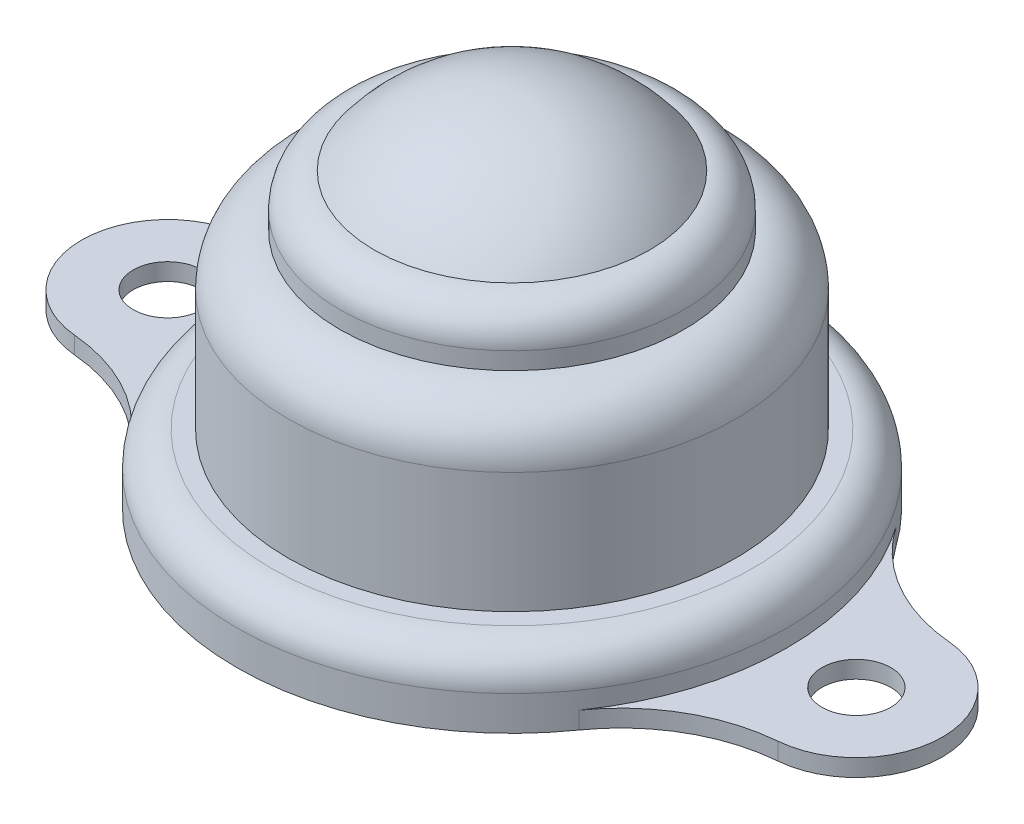
ISO-10303-21;
HEADER;
FILE_DESCRIPTION(('STEP AP214'),'2;1');
FILE_NAME('part.step','',(''),(''),'','','');
FILE_SCHEMA(('AUTOMOTIVE_DESIGN { 1 0 10303 214 1 1 1 1 }'));
ENDSEC;
DATA;
#1=APPLICATION_CONTEXT('core data for automotive mechanical design processes');
#2=APPLICATION_PROTOCOL_DEFINITION('international standard','automotive_design',2000,#1);
#3=PRODUCT_CONTEXT('',#1,'mechanical');
#4=PRODUCT('Part','Part','',(#3));
#5=PRODUCT_RELATED_PRODUCT_CATEGORY('part','',(#4));
#6=PRODUCT_DEFINITION_FORMATION('','',#4);
#7=PRODUCT_DEFINITION_CONTEXT('part definition',#1,'design');
#8=PRODUCT_DEFINITION('design','',#6,#7);
#9=PRODUCT_DEFINITION_SHAPE('','',#8);
#10=(LENGTH_UNIT() NAMED_UNIT(*) SI_UNIT(.MILLI.,.METRE.));
#11=(NAMED_UNIT(*) PLANE_ANGLE_UNIT() SI_UNIT($,.RADIAN.));
#12=(NAMED_UNIT(*) SI_UNIT($,.STERADIAN.) SOLID_ANGLE_UNIT());
#13=UNCERTAINTY_MEASURE_WITH_UNIT(LENGTH_MEASURE(1.E-05),#10,'distance_accuracy_value','');
#14=(GEOMETRIC_REPRESENTATION_CONTEXT(3) GLOBAL_UNCERTAINTY_ASSIGNED_CONTEXT((#13)) GLOBAL_UNIT_ASSIGNED_CONTEXT((#10,
#11,#12)) REPRESENTATION_CONTEXT('',''));
#15=CARTESIAN_POINT('',(0.,0.,0.));
#16=DIRECTION('',(0.,0.,1.));
#17=DIRECTION('',(1.,0.,0.));
#18=AXIS2_PLACEMENT_3D('',#15,#16,#17);
#19=CARTESIAN_POINT('',(0.,14.,0.));
#20=DIRECTION('',(0.,1.,0.));
#21=DIRECTION('',(0.,0.,1.));
#22=AXIS2_PLACEMENT_3D('',#19,#20,#21);
#23=PLANE('',#22);
#24=CARTESIAN_POINT('',(0.,14.,0.));
#25=DIRECTION('',(0.,1.,0.));
#26=DIRECTION('',(0.,0.,1.));
#27=AXIS2_PLACEMENT_3D('',#24,#25,#26);
#28=CIRCLE('',#27,9.53939201416945);
#29=CARTESIAN_POINT('',(0.,14.,9.53939201416945));
#30=VERTEX_POINT('',#29);
#31=EDGE_CURVE('E12',#30,#30,#28,.F.);
#32=ORIENTED_EDGE('',*,*,#31,.F.);
#33=EDGE_LOOP('',(#32));
#34=FACE_BOUND('',#33,.T.);
#35=CARTESIAN_POINT('',(0.,14.,0.));
#36=DIRECTION('',(0.,1.,0.));
#37=DIRECTION('',(0.,0.,1.));
#38=AXIS2_PLACEMENT_3D('',#35,#36,#37);
#39=CIRCLE('',#38,10.);
#40=CARTESIAN_POINT('',(0.,14.,10.));
#41=VERTEX_POINT('',#40);
#42=EDGE_CURVE('E63',#41,#41,#39,.T.);
#43=ORIENTED_EDGE('',*,*,#42,.F.);
#44=EDGE_LOOP('',(#43));
#45=FACE_BOUND('',#44,.T.);
#46=ADVANCED_FACE('F51',(#34,#45),#23,.F.);
#47=CARTESIAN_POINT('',(0.,17.,0.));
#48=DIRECTION('',(0.,-1.,0.));
#49=DIRECTION('',(0.,0.,-1.));
#50=AXIS2_PLACEMENT_3D('',#47,#48,#49);
#51=CYLINDRICAL_SURFACE('',#50,10.);
#52=CARTESIAN_POINT('',(0.,15.,0.));
#53=DIRECTION('',(0.,1.,0.));
#54=DIRECTION('',(0.,0.,1.));
#55=AXIS2_PLACEMENT_3D('',#52,#53,#54);
#56=CIRCLE('',#55,10.);
#57=CARTESIAN_POINT('',(0.,15.,10.));
#58=VERTEX_POINT('',#57);
#59=EDGE_CURVE('E55',#58,#58,#56,.F.);
#60=ORIENTED_EDGE('',*,*,#59,.T.);
#61=EDGE_LOOP('',(#60));
#62=FACE_BOUND('',#61,.T.);
#63=ORIENTED_EDGE('',*,*,#42,.T.);
#64=EDGE_LOOP('',(#63));
#65=FACE_BOUND('',#64,.T.);
#66=ADVANCED_FACE('F70',(#62,#65),#51,.T.);
#67=CARTESIAN_POINT('',(0.,15.,0.));
#68=DIRECTION('',(0.,1.,0.));
#69=DIRECTION('',(0.,0.,1.));
#70=AXIS2_PLACEMENT_3D('',#67,#68,#69);
#71=TOROIDAL_SURFACE('',#70,8.,2.);
#72=ORIENTED_EDGE('',*,*,#59,.F.);
#73=EDGE_LOOP('',(#72));
#74=FACE_BOUND('',#73,.T.);
#75=CARTESIAN_POINT('',(0.,17.,0.));
#76=DIRECTION('',(0.,1.,0.));
#77=DIRECTION('',(0.,0.,1.));
#78=AXIS2_PLACEMENT_3D('',#75,#76,#77);
#79=CIRCLE('',#78,8.);
#80=CARTESIAN_POINT('',(0.,17.,8.));
#81=VERTEX_POINT('',#80);
#82=EDGE_CURVE('E65',#81,#81,#79,.T.);
#83=ORIENTED_EDGE('',*,*,#82,.F.);
#84=EDGE_LOOP('',(#83));
#85=FACE_BOUND('',#84,.T.);
#86=ADVANCED_FACE('F53',(#74,#85),#71,.T.);
#87=CARTESIAN_POINT('',(0.,11.,0.));
#88=DIRECTION('',(0.,-1.,0.));
#89=DIRECTION('',(-1.,0.,0.));
#90=AXIS2_PLACEMENT_3D('',#87,#88,#89);
#91=SPHERICAL_SURFACE('',#90,10.);
#92=ORIENTED_EDGE('',*,*,#82,.T.);
#93=EDGE_LOOP('',(#92));
#94=FACE_BOUND('',#93,.T.);
#95=ADVANCED_FACE('F80',(#94),#91,.T.);
#96=ORIENTED_EDGE('',*,*,#31,.T.);
#97=EDGE_LOOP('',(#96));
#98=FACE_BOUND('',#97,.T.);
#99=ADVANCED_FACE('F82',(#98),#91,.T.);
#100=CLOSED_SHELL('',(#46,#66,#86,#95,#99));
#101=MANIFOLD_SOLID_BREP('B2',#100);
#102=CARTESIAN_POINT('',(0.,4.,0.));
#103=DIRECTION('',(0.,1.,0.));
#104=DIRECTION('',(0.,0.,1.));
#105=AXIS2_PLACEMENT_3D('',#102,#103,#104);
#106=PLANE('',#105);
#107=CARTESIAN_POINT('',(0.,4.,0.));
#108=DIRECTION('',(0.,1.,0.));
#109=DIRECTION('',(0.,0.,1.));
#110=AXIS2_PLACEMENT_3D('',#107,#108,#109);
#111=CIRCLE('',#110,13.);
#112=CARTESIAN_POINT('',(0.,4.,13.));
#113=VERTEX_POINT('',#112);
#114=EDGE_CURVE('E136',#113,#113,#111,.T.);
#115=ORIENTED_EDGE('',*,*,#114,.F.);
#116=EDGE_LOOP('',(#115));
#117=FACE_BOUND('',#116,.T.);
#118=CARTESIAN_POINT('',(0.,4.,0.));
#119=DIRECTION('',(0.,1.,0.));
#120=DIRECTION('',(0.,0.,1.));
#121=AXIS2_PLACEMENT_3D('',#118,#119,#120);
#122=CIRCLE('',#121,10.);
#123=CARTESIAN_POINT('',(0.,4.,10.));
#124=VERTEX_POINT('',#123);
#125=EDGE_CURVE('E144',#124,#124,#122,.T.);
#126=ORIENTED_EDGE('',*,*,#125,.T.);
#127=EDGE_LOOP('',(#126));
#128=FACE_BOUND('',#127,.T.);
#129=ADVANCED_FACE('F129',(#117,#128),#106,.F.);
#130=CARTESIAN_POINT('',(0.,14.,0.));
#131=DIRECTION('',(0.,-1.,0.));
#132=DIRECTION('',(0.,0.,-1.));
#133=AXIS2_PLACEMENT_3D('',#130,#131,#132);
#134=CYLINDRICAL_SURFACE('',#133,13.);
#135=CARTESIAN_POINT('',(0.,11.,0.));
#136=DIRECTION('',(0.,1.,0.));
#137=DIRECTION('',(0.,0.,1.));
#138=AXIS2_PLACEMENT_3D('',#135,#136,#137);
#139=CIRCLE('',#138,13.);
#140=CARTESIAN_POINT('',(0.,11.,13.));
#141=VERTEX_POINT('',#140);
#142=EDGE_CURVE('E50',#141,#141,#139,.F.);
#143=ORIENTED_EDGE('',*,*,#142,.T.);
#144=EDGE_LOOP('',(#143));
#145=FACE_BOUND('',#144,.T.);
#146=ORIENTED_EDGE('',*,*,#114,.T.);
#147=EDGE_LOOP('',(#146));
#148=FACE_BOUND('',#147,.T.);
#149=ADVANCED_FACE('F154',(#145,#148),#134,.T.);
#150=CARTESIAN_POINT('',(0.,14.,0.));
#151=DIRECTION('',(0.,-1.,0.));
#152=DIRECTION('',(0.,0.,-1.));
#153=AXIS2_PLACEMENT_3D('',#150,#151,#152);
#154=CYLINDRICAL_SURFACE('',#153,10.);
#155=ORIENTED_EDGE('',*,*,#125,.F.);
#156=EDGE_LOOP('',(#155));
#157=FACE_BOUND('',#156,.T.);
#158=CARTESIAN_POINT('',(0.,14.,0.));
#159=DIRECTION('',(0.,1.,0.));
#160=DIRECTION('',(0.,0.,1.));
#161=AXIS2_PLACEMENT_3D('',#158,#159,#160);
#162=CIRCLE('',#161,10.);
#163=CARTESIAN_POINT('',(0.,14.,10.));
#164=VERTEX_POINT('',#163);
#165=EDGE_CURVE('E140',#164,#164,#162,.T.);
#166=ORIENTED_EDGE('',*,*,#165,.T.);
#167=EDGE_LOOP('',(#166));
#168=FACE_BOUND('',#167,.T.);
#169=ADVANCED_FACE('F151',(#157,#168),#154,.F.);
#170=CARTESIAN_POINT('',(0.,11.,0.));
#171=DIRECTION('',(0.,1.,0.));
#172=DIRECTION('',(0.,0.,1.));
#173=AXIS2_PLACEMENT_3D('',#170,#171,#172);
#174=TOROIDAL_SURFACE('',#173,10.,3.);
#175=ORIENTED_EDGE('',*,*,#142,.F.);
#176=EDGE_LOOP('',(#175));
#177=FACE_BOUND('',#176,.T.);
#178=ORIENTED_EDGE('',*,*,#165,.F.);
#179=EDGE_LOOP('',(#178));
#180=FACE_BOUND('',#179,.T.);
#181=ADVANCED_FACE('F131',(#177,#180),#174,.T.);
#182=CLOSED_SHELL('',(#129,#149,#169,#181));
#183=MANIFOLD_SOLID_BREP('B7',#182);
#184=CARTESIAN_POINT('',(0.,1.,0.));
#185=DIRECTION('',(0.,1.,0.));
#186=DIRECTION('',(0.,0.,1.));
#187=AXIS2_PLACEMENT_3D('',#184,#185,#186);
#188=PLANE('',#187);
#189=CARTESIAN_POINT('',(0.,1.,0.));
#190=DIRECTION('',(0.,1.,0.));
#191=DIRECTION('',(0.,0.,1.));
#192=AXIS2_PLACEMENT_3D('',#189,#190,#191);
#193=CIRCLE('',#192,16.);
#194=CARTESIAN_POINT('',(13.0923076923077,1.,9.1973626268589));
#195=VERTEX_POINT('',#194);
#196=CARTESIAN_POINT('',(13.0923076923077,1.,-9.1973626268589));
#197=VERTEX_POINT('',#196);
#198=EDGE_CURVE('E299',#195,#197,#193,.T.);
#199=ORIENTED_EDGE('',*,*,#198,.F.);
#200=CARTESIAN_POINT('',(21.275,1.,14.9457142686457));
#201=DIRECTION('',(0.,1.,0.));
#202=DIRECTION('',(0.,0.,1.));
#203=AXIS2_PLACEMENT_3D('',#200,#201,#202);
#204=CIRCLE('',#203,10.);
#205=CARTESIAN_POINT('',(20.425,1.,4.98190475621524));
#206=VERTEX_POINT('',#205);
#207=EDGE_CURVE('E270',#206,#195,#204,.T.);
#208=ORIENTED_EDGE('',*,*,#207,.F.);
#209=CARTESIAN_POINT('',(20.,1.,0.));
#210=DIRECTION('',(0.,1.,0.));
#211=DIRECTION('',(0.,0.,1.));
#212=AXIS2_PLACEMENT_3D('',#209,#210,#211);
#213=CIRCLE('',#212,5.);
#214=CARTESIAN_POINT('',(20.425,1.,-4.98190475621524));
#215=VERTEX_POINT('',#214);
#216=EDGE_CURVE('E262',#206,#215,#213,.T.);
#217=ORIENTED_EDGE('',*,*,#216,.T.);
#218=CARTESIAN_POINT('',(21.275,1.,-14.9457142686457));
#219=DIRECTION('',(0.,1.,0.));
#220=DIRECTION('',(0.,0.,1.));
#221=AXIS2_PLACEMENT_3D('',#218,#219,#220);
#222=CIRCLE('',#221,10.);
#223=EDGE_CURVE('E267',#215,#197,#222,.F.);
#224=ORIENTED_EDGE('',*,*,#223,.T.);
#225=EDGE_LOOP('',(#199,#208,#217,#224));
#226=FACE_BOUND('',#225,.T.);
#227=CARTESIAN_POINT('',(20.,1.,0.));
#228=DIRECTION('',(0.,1.,0.));
#229=DIRECTION('',(0.,0.,1.));
#230=AXIS2_PLACEMENT_3D('',#227,#228,#229);
#231=CIRCLE('',#230,2.);
#232=CARTESIAN_POINT('',(20.,1.,2.));
#233=VERTEX_POINT('',#232);
#234=EDGE_CURVE('E286',#233,#233,#231,.T.);
#235=ORIENTED_EDGE('',*,*,#234,.F.);
#236=EDGE_LOOP('',(#235));
#237=FACE_BOUND('',#236,.T.);
#238=ADVANCED_FACE('F190',(#226,#237),#188,.T.);
#239=CARTESIAN_POINT('',(-21.275,1.,-14.9457142686457));
#240=DIRECTION('',(0.,-1.,0.));
#241=DIRECTION('',(0.,0.,-1.));
#242=AXIS2_PLACEMENT_3D('',#239,#240,#241);
#243=CYLINDRICAL_SURFACE('',#242,10.);
#244=CARTESIAN_POINT('',(-21.275,0.,-14.9457142686457));
#245=DIRECTION('',(0.,1.,0.));
#246=DIRECTION('',(0.,0.,1.));
#247=AXIS2_PLACEMENT_3D('',#244,#245,#246);
#248=CIRCLE('',#247,10.);
#249=CARTESIAN_POINT('',(-20.425,0.,-4.98190475621524));
#250=VERTEX_POINT('',#249);
#251=CARTESIAN_POINT('',(-13.0923076923077,0.,-9.1973626268589));
#252=VERTEX_POINT('',#251);
#253=EDGE_CURVE('E295',#250,#252,#248,.T.);
#254=ORIENTED_EDGE('',*,*,#253,.F.);
#255=DIRECTION('',(0.,-1.,0.));
#256=VECTOR('',#255,1.);
#257=CARTESIAN_POINT('',(-20.425,1.,-4.98190475621524));
#258=LINE('',#257,#256);
#259=CARTESIAN_POINT('',(-20.425,1.,-4.98190475621524));
#260=VERTEX_POINT('',#259);
#261=EDGE_CURVE('E248',#260,#250,#258,.T.);
#262=ORIENTED_EDGE('',*,*,#261,.F.);
#263=CARTESIAN_POINT('',(-21.275,1.,-14.9457142686457));
#264=DIRECTION('',(0.,1.,0.));
#265=DIRECTION('',(0.,0.,1.));
#266=AXIS2_PLACEMENT_3D('',#263,#264,#265);
#267=CIRCLE('',#266,10.);
#268=CARTESIAN_POINT('',(-13.0923076923077,1.,-9.1973626268589));
#269=VERTEX_POINT('',#268);
#270=EDGE_CURVE('E320',#260,#269,#267,.T.);
#271=ORIENTED_EDGE('',*,*,#270,.T.);
#272=DIRECTION('',(0.,-1.,0.));
#273=VECTOR('',#272,1.);
#274=CARTESIAN_POINT('',(-13.0923076923077,1.,-9.1973626268589));
#275=LINE('',#274,#273);
#276=EDGE_CURVE('E243',#269,#252,#275,.T.);
#277=ORIENTED_EDGE('',*,*,#276,.T.);
#278=EDGE_LOOP('',(#254,#262,#271,#277));
#279=FACE_BOUND('',#278,.T.);
#280=ADVANCED_FACE('F364',(#279),#243,.F.);
#281=CARTESIAN_POINT('',(-20.,1.,0.));
#282=DIRECTION('',(0.,-1.,0.));
#283=DIRECTION('',(0.,0.,-1.));
#284=AXIS2_PLACEMENT_3D('',#281,#282,#283);
#285=CYLINDRICAL_SURFACE('',#284,5.);
#286=CARTESIAN_POINT('',(-20.,0.,0.));
#287=DIRECTION('',(0.,1.,0.));
#288=DIRECTION('',(0.,0.,1.));
#289=AXIS2_PLACEMENT_3D('',#286,#287,#288);
#290=CIRCLE('',#289,5.);
#291=CARTESIAN_POINT('',(-20.425,0.,4.98190475621524));
#292=VERTEX_POINT('',#291);
#293=EDGE_CURVE('E298',#250,#292,#290,.T.);
#294=ORIENTED_EDGE('',*,*,#293,.T.);
#295=DIRECTION('',(0.,-1.,0.));
#296=VECTOR('',#295,1.);
#297=CARTESIAN_POINT('',(-20.425,1.,4.98190475621524));
#298=LINE('',#297,#296);
#299=CARTESIAN_POINT('',(-20.425,1.,4.98190475621524));
#300=VERTEX_POINT('',#299);
#301=EDGE_CURVE('E329',#300,#292,#298,.T.);
#302=ORIENTED_EDGE('',*,*,#301,.F.);
#303=CARTESIAN_POINT('',(-20.,1.,0.));
#304=DIRECTION('',(0.,1.,0.));
#305=DIRECTION('',(0.,0.,1.));
#306=AXIS2_PLACEMENT_3D('',#303,#304,#305);
#307=CIRCLE('',#306,5.);
#308=EDGE_CURVE('E420',#260,#300,#307,.T.);
#309=ORIENTED_EDGE('',*,*,#308,.F.);
#310=ORIENTED_EDGE('',*,*,#261,.T.);
#311=EDGE_LOOP('',(#294,#302,#309,#310));
#312=FACE_BOUND('',#311,.T.);
#313=ADVANCED_FACE('F368',(#312),#285,.T.);
#314=CARTESIAN_POINT('',(-21.275,1.,14.9457142686457));
#315=DIRECTION('',(0.,-1.,0.));
#316=DIRECTION('',(0.,0.,-1.));
#317=AXIS2_PLACEMENT_3D('',#314,#315,#316);
#318=CYLINDRICAL_SURFACE('',#317,10.);
#319=CARTESIAN_POINT('',(-21.275,0.,14.9457142686457));
#320=DIRECTION('',(0.,1.,0.));
#321=DIRECTION('',(0.,0.,1.));
#322=AXIS2_PLACEMENT_3D('',#319,#320,#321);
#323=CIRCLE('',#322,10.);
#324=CARTESIAN_POINT('',(-13.0923076923077,0.,9.19736262685889));
#325=VERTEX_POINT('',#324);
#326=EDGE_CURVE('E301',#292,#325,#323,.F.);
#327=ORIENTED_EDGE('',*,*,#326,.T.);
#328=DIRECTION('',(0.,-1.,0.));
#329=VECTOR('',#328,1.);
#330=CARTESIAN_POINT('',(-13.0923076923077,1.,9.19736262685889));
#331=LINE('',#330,#329);
#332=CARTESIAN_POINT('',(-13.0923076923077,1.,9.19736262685889));
#333=VERTEX_POINT('',#332);
#334=EDGE_CURVE('E326',#333,#325,#331,.T.);
#335=ORIENTED_EDGE('',*,*,#334,.F.);
#336=CARTESIAN_POINT('',(-21.275,1.,14.9457142686457));
#337=DIRECTION('',(0.,1.,0.));
#338=DIRECTION('',(0.,0.,1.));
#339=AXIS2_PLACEMENT_3D('',#336,#337,#338);
#340=CIRCLE('',#339,10.);
#341=EDGE_CURVE('E416',#300,#333,#340,.F.);
#342=ORIENTED_EDGE('',*,*,#341,.F.);
#343=ORIENTED_EDGE('',*,*,#301,.T.);
#344=EDGE_LOOP('',(#327,#335,#342,#343));
#345=FACE_BOUND('',#344,.T.);
#346=ADVANCED_FACE('F402',(#345),#318,.F.);
#347=CARTESIAN_POINT('',(21.275,1.,14.9457142686457));
#348=DIRECTION('',(0.,-1.,0.));
#349=DIRECTION('',(0.,0.,-1.));
#350=AXIS2_PLACEMENT_3D('',#347,#348,#349);
#351=CYLINDRICAL_SURFACE('',#350,10.);
#352=CARTESIAN_POINT('',(21.275,0.,14.9457142686457));
#353=DIRECTION('',(0.,1.,0.));
#354=DIRECTION('',(0.,0.,1.));
#355=AXIS2_PLACEMENT_3D('',#352,#353,#354);
#356=CIRCLE('',#355,10.);
#357=CARTESIAN_POINT('',(20.425,0.,4.98190475621524));
#358=VERTEX_POINT('',#357);
#359=CARTESIAN_POINT('',(13.0923076923077,0.,9.1973626268589));
#360=VERTEX_POINT('',#359);
#361=EDGE_CURVE('E306',#358,#360,#356,.T.);
#362=ORIENTED_EDGE('',*,*,#361,.F.);
#363=DIRECTION('',(0.,-1.,0.));
#364=VECTOR('',#363,1.);
#365=CARTESIAN_POINT('',(20.425,1.,4.98190475621524));
#366=LINE('',#365,#364);
#367=EDGE_CURVE('E280',#206,#358,#366,.T.);
#368=ORIENTED_EDGE('',*,*,#367,.F.);
#369=ORIENTED_EDGE('',*,*,#207,.T.);
#370=DIRECTION('',(0.,-1.,0.));
#371=VECTOR('',#370,1.);
#372=CARTESIAN_POINT('',(13.0923076923077,1.,9.1973626268589));
#373=LINE('',#372,#371);
#374=EDGE_CURVE('E324',#195,#360,#373,.T.);
#375=ORIENTED_EDGE('',*,*,#374,.T.);
#376=EDGE_LOOP('',(#362,#368,#369,#375));
#377=FACE_BOUND('',#376,.T.);
#378=ADVANCED_FACE('F399',(#377),#351,.F.);
#379=CARTESIAN_POINT('',(20.,1.,0.));
#380=DIRECTION('',(0.,-1.,0.));
#381=DIRECTION('',(0.,0.,-1.));
#382=AXIS2_PLACEMENT_3D('',#379,#380,#381);
#383=CYLINDRICAL_SURFACE('',#382,5.);
#384=CARTESIAN_POINT('',(20.,0.,0.));
#385=DIRECTION('',(0.,1.,0.));
#386=DIRECTION('',(0.,0.,1.));
#387=AXIS2_PLACEMENT_3D('',#384,#385,#386);
#388=CIRCLE('',#387,5.);
#389=CARTESIAN_POINT('',(20.425,0.,-4.98190475621524));
#390=VERTEX_POINT('',#389);
#391=EDGE_CURVE('E277',#358,#390,#388,.T.);
#392=ORIENTED_EDGE('',*,*,#391,.T.);
#393=DIRECTION('',(0.,-1.,0.));
#394=VECTOR('',#393,1.);
#395=CARTESIAN_POINT('',(20.425,1.,-4.98190475621524));
#396=LINE('',#395,#394);
#397=EDGE_CURVE('E274',#215,#390,#396,.T.);
#398=ORIENTED_EDGE('',*,*,#397,.F.);
#399=ORIENTED_EDGE('',*,*,#216,.F.);
#400=ORIENTED_EDGE('',*,*,#367,.T.);
#401=EDGE_LOOP('',(#392,#398,#399,#400));
#402=FACE_BOUND('',#401,.T.);
#403=ADVANCED_FACE('F275',(#402),#383,.T.);
#404=CARTESIAN_POINT('',(21.275,1.,-14.9457142686457));
#405=DIRECTION('',(0.,-1.,0.));
#406=DIRECTION('',(0.,0.,-1.));
#407=AXIS2_PLACEMENT_3D('',#404,#405,#406);
#408=CYLINDRICAL_SURFACE('',#407,10.);
#409=CARTESIAN_POINT('',(21.275,0.,-14.9457142686457));
#410=DIRECTION('',(0.,1.,0.));
#411=DIRECTION('',(0.,0.,1.));
#412=AXIS2_PLACEMENT_3D('',#409,#410,#411);
#413=CIRCLE('',#412,10.);
#414=CARTESIAN_POINT('',(13.0923076923077,0.,-9.1973626268589));
#415=VERTEX_POINT('',#414);
#416=EDGE_CURVE('E310',#390,#415,#413,.F.);
#417=ORIENTED_EDGE('',*,*,#416,.T.);
#418=DIRECTION('',(0.,-1.,0.));
#419=VECTOR('',#418,1.);
#420=CARTESIAN_POINT('',(13.0923076923077,1.,-9.1973626268589));
#421=LINE('',#420,#419);
#422=EDGE_CURVE('E281',#197,#415,#421,.T.);
#423=ORIENTED_EDGE('',*,*,#422,.F.);
#424=ORIENTED_EDGE('',*,*,#223,.F.);
#425=ORIENTED_EDGE('',*,*,#397,.T.);
#426=EDGE_LOOP('',(#417,#423,#424,#425));
#427=FACE_BOUND('',#426,.T.);
#428=ADVANCED_FACE('F283',(#427),#408,.F.);
#429=CARTESIAN_POINT('',(20.,1.,0.));
#430=DIRECTION('',(0.,-1.,0.));
#431=DIRECTION('',(0.,0.,-1.));
#432=AXIS2_PLACEMENT_3D('',#429,#430,#431);
#433=CYLINDRICAL_SURFACE('',#432,2.);
#434=ORIENTED_EDGE('',*,*,#234,.T.);
#435=EDGE_LOOP('',(#434));
#436=FACE_BOUND('',#435,.T.);
#437=CARTESIAN_POINT('',(20.,0.,0.));
#438=DIRECTION('',(0.,1.,0.));
#439=DIRECTION('',(0.,0.,1.));
#440=AXIS2_PLACEMENT_3D('',#437,#438,#439);
#441=CIRCLE('',#440,2.);
#442=CARTESIAN_POINT('',(20.,0.,2.));
#443=VERTEX_POINT('',#442);
#444=EDGE_CURVE('E314',#443,#443,#441,.T.);
#445=ORIENTED_EDGE('',*,*,#444,.F.);
#446=EDGE_LOOP('',(#445));
#447=FACE_BOUND('',#446,.T.);
#448=ADVANCED_FACE('F388',(#436,#447),#433,.F.);
#449=CARTESIAN_POINT('',(0.,1.,0.));
#450=DIRECTION('',(0.,-1.,0.));
#451=DIRECTION('',(0.,0.,-1.));
#452=AXIS2_PLACEMENT_3D('',#449,#450,#451);
#453=CYLINDRICAL_SURFACE('',#452,16.);
#454=CARTESIAN_POINT('',(0.,2.,0.));
#455=DIRECTION('',(0.,1.,0.));
#456=DIRECTION('',(0.,0.,1.));
#457=AXIS2_PLACEMENT_3D('',#454,#455,#456);
#458=CIRCLE('',#457,16.);
#459=CARTESIAN_POINT('',(0.,2.,16.));
#460=VERTEX_POINT('',#459);
#461=EDGE_CURVE('E127',#460,#460,#458,.F.);
#462=ORIENTED_EDGE('',*,*,#461,.T.);
#463=EDGE_LOOP('',(#462));
#464=FACE_BOUND('',#463,.T.);
#465=CARTESIAN_POINT('',(0.,0.,0.));
#466=DIRECTION('',(0.,1.,0.));
#467=DIRECTION('',(0.,0.,1.));
#468=AXIS2_PLACEMENT_3D('',#465,#466,#467);
#469=CIRCLE('',#468,16.);
#470=EDGE_CURVE('E312',#415,#252,#469,.T.);
#471=ORIENTED_EDGE('',*,*,#470,.T.);
#472=ORIENTED_EDGE('',*,*,#276,.F.);
#473=EDGE_CURVE('E209',#269,#333,#193,.T.);
#474=ORIENTED_EDGE('',*,*,#473,.T.);
#475=ORIENTED_EDGE('',*,*,#334,.T.);
#476=CARTESIAN_POINT('',(0.,0.,0.));
#477=DIRECTION('',(0.,1.,0.));
#478=DIRECTION('',(0.,0.,1.));
#479=AXIS2_PLACEMENT_3D('',#476,#477,#478);
#480=CIRCLE('',#479,16.);
#481=EDGE_CURVE('E303',#325,#360,#480,.T.);
#482=ORIENTED_EDGE('',*,*,#481,.T.);
#483=ORIENTED_EDGE('',*,*,#374,.F.);
#484=ORIENTED_EDGE('',*,*,#198,.T.);
#485=ORIENTED_EDGE('',*,*,#422,.T.);
#486=EDGE_LOOP('',(#471,#472,#474,#475,#482,#483,#484,#485));
#487=FACE_BOUND('',#486,.T.);
#488=ADVANCED_FACE('F377',(#464,#487),#453,.T.);
#489=CARTESIAN_POINT('',(-20.,1.,0.));
#490=DIRECTION('',(0.,-1.,0.));
#491=DIRECTION('',(0.,0.,-1.));
#492=AXIS2_PLACEMENT_3D('',#489,#490,#491);
#493=CYLINDRICAL_SURFACE('',#492,2.);
#494=CARTESIAN_POINT('',(-20.,1.,0.));
#495=DIRECTION('',(0.,1.,0.));
#496=DIRECTION('',(0.,0.,1.));
#497=AXIS2_PLACEMENT_3D('',#494,#495,#496);
#498=CIRCLE('',#497,2.);
#499=CARTESIAN_POINT('',(-20.,1.,2.));
#500=VERTEX_POINT('',#499);
#501=EDGE_CURVE('E289',#500,#500,#498,.T.);
#502=ORIENTED_EDGE('',*,*,#501,.T.);
#503=EDGE_LOOP('',(#502));
#504=FACE_BOUND('',#503,.T.);
#505=CARTESIAN_POINT('',(-20.,0.,0.));
#506=DIRECTION('',(0.,1.,0.));
#507=DIRECTION('',(0.,0.,1.));
#508=AXIS2_PLACEMENT_3D('',#505,#506,#507);
#509=CIRCLE('',#508,2.);
#510=CARTESIAN_POINT('',(-20.,0.,2.));
#511=VERTEX_POINT('',#510);
#512=EDGE_CURVE('E317',#511,#511,#509,.T.);
#513=ORIENTED_EDGE('',*,*,#512,.F.);
#514=EDGE_LOOP('',(#513));
#515=FACE_BOUND('',#514,.T.);
#516=ADVANCED_FACE('F371',(#504,#515),#493,.F.);
#517=ORIENTED_EDGE('',*,*,#473,.F.);
#518=ORIENTED_EDGE('',*,*,#270,.F.);
#519=ORIENTED_EDGE('',*,*,#308,.T.);
#520=ORIENTED_EDGE('',*,*,#341,.T.);
#521=EDGE_LOOP('',(#517,#518,#519,#520));
#522=FACE_BOUND('',#521,.T.);
#523=ORIENTED_EDGE('',*,*,#501,.F.);
#524=EDGE_LOOP('',(#523));
#525=FACE_BOUND('',#524,.T.);
#526=ADVANCED_FACE('F360',(#522,#525),#188,.T.);
#527=CARTESIAN_POINT('',(0.,0.,0.));
#528=DIRECTION('',(0.,1.,0.));
#529=DIRECTION('',(0.,0.,1.));
#530=AXIS2_PLACEMENT_3D('',#527,#528,#529);
#531=PLANE('',#530);
#532=ORIENTED_EDGE('',*,*,#253,.T.);
#533=ORIENTED_EDGE('',*,*,#470,.F.);
#534=ORIENTED_EDGE('',*,*,#416,.F.);
#535=ORIENTED_EDGE('',*,*,#391,.F.);
#536=ORIENTED_EDGE('',*,*,#361,.T.);
#537=ORIENTED_EDGE('',*,*,#481,.F.);
#538=ORIENTED_EDGE('',*,*,#326,.F.);
#539=ORIENTED_EDGE('',*,*,#293,.F.);
#540=EDGE_LOOP('',(#532,#533,#534,#535,#536,#537,#538,#539));
#541=FACE_BOUND('',#540,.T.);
#542=ORIENTED_EDGE('',*,*,#444,.T.);
#543=EDGE_LOOP('',(#542));
#544=FACE_BOUND('',#543,.T.);
#545=ORIENTED_EDGE('',*,*,#512,.T.);
#546=EDGE_LOOP('',(#545));
#547=FACE_BOUND('',#546,.T.);
#548=ADVANCED_FACE('F361',(#541,#544,#547),#531,.F.);
#549=CARTESIAN_POINT('',(0.,4.,0.));
#550=DIRECTION('',(0.,1.,0.));
#551=DIRECTION('',(0.,0.,1.));
#552=AXIS2_PLACEMENT_3D('',#549,#550,#551);
#553=PLANE('',#552);
#554=CARTESIAN_POINT('',(0.,4.,0.));
#555=DIRECTION('',(0.,1.,0.));
#556=DIRECTION('',(0.,0.,1.));
#557=AXIS2_PLACEMENT_3D('',#554,#555,#556);
#558=CIRCLE('',#557,14.);
#559=CARTESIAN_POINT('',(0.,4.,14.));
#560=VERTEX_POINT('',#559);
#561=EDGE_CURVE('E198',#560,#560,#558,.T.);
#562=ORIENTED_EDGE('',*,*,#561,.T.);
#563=EDGE_LOOP('',(#562));
#564=FACE_BOUND('',#563,.T.);
#565=CARTESIAN_POINT('',(0.,4.,0.));
#566=DIRECTION('',(0.,1.,0.));
#567=DIRECTION('',(0.,0.,1.));
#568=AXIS2_PLACEMENT_3D('',#565,#566,#567);
#569=CIRCLE('',#568,13.);
#570=CARTESIAN_POINT('',(0.,4.,13.));
#571=VERTEX_POINT('',#570);
#572=EDGE_CURVE('E339',#571,#571,#569,.T.);
#573=ORIENTED_EDGE('',*,*,#572,.F.);
#574=EDGE_LOOP('',(#573));
#575=FACE_BOUND('',#574,.T.);
#576=ADVANCED_FACE('F353',(#564,#575),#553,.T.);
#577=CARTESIAN_POINT('',(0.,4.,0.));
#578=DIRECTION('',(0.,-1.,0.));
#579=DIRECTION('',(0.,0.,-1.));
#580=AXIS2_PLACEMENT_3D('',#577,#578,#579);
#581=CYLINDRICAL_SURFACE('',#580,13.);
#582=ORIENTED_EDGE('',*,*,#572,.T.);
#583=EDGE_LOOP('',(#582));
#584=FACE_BOUND('',#583,.T.);
#585=CARTESIAN_POINT('',(0.,1.,0.));
#586=DIRECTION('',(0.,1.,0.));
#587=DIRECTION('',(0.,0.,1.));
#588=AXIS2_PLACEMENT_3D('',#585,#586,#587);
#589=CIRCLE('',#588,13.);
#590=CARTESIAN_POINT('',(0.,1.,13.));
#591=VERTEX_POINT('',#590);
#592=EDGE_CURVE('E342',#591,#591,#589,.T.);
#593=ORIENTED_EDGE('',*,*,#592,.F.);
#594=EDGE_LOOP('',(#593));
#595=FACE_BOUND('',#594,.T.);
#596=ADVANCED_FACE('F351',(#584,#595),#581,.F.);
#597=CARTESIAN_POINT('',(0.,1.,0.));
#598=VERTEX_POINT('',#597);
#599=VERTEX_LOOP('',#598);
#600=FACE_BOUND('',#599,.T.);
#601=ORIENTED_EDGE('',*,*,#592,.T.);
#602=EDGE_LOOP('',(#601));
#603=FACE_BOUND('',#602,.T.);
#604=ADVANCED_FACE('F349',(#600,#603),#188,.T.);
#605=CARTESIAN_POINT('',(0.,2.,0.));
#606=DIRECTION('',(0.,1.,0.));
#607=DIRECTION('',(0.,0.,1.));
#608=AXIS2_PLACEMENT_3D('',#605,#606,#607);
#609=TOROIDAL_SURFACE('',#608,14.,2.);
#610=ORIENTED_EDGE('',*,*,#461,.F.);
#611=EDGE_LOOP('',(#610));
#612=FACE_BOUND('',#611,.T.);
#613=ORIENTED_EDGE('',*,*,#561,.F.);
#614=EDGE_LOOP('',(#613));
#615=FACE_BOUND('',#614,.T.);
#616=ADVANCED_FACE('F192',(#612,#615),#609,.T.);
#617=CLOSED_SHELL('',(#238,#280,#313,#346,#378,#403,#428,#448,#488,#516,#526,#548,#576,#596,
#604,#616));
#618=MANIFOLD_SOLID_BREP('B45',#617);
#619=ADVANCED_BREP_SHAPE_REPRESENTATION('',(#18,#101,#183,#618),#14);
#620=SHAPE_DEFINITION_REPRESENTATION(#9,#619);
ENDSEC;
END-ISO-10303-21;
